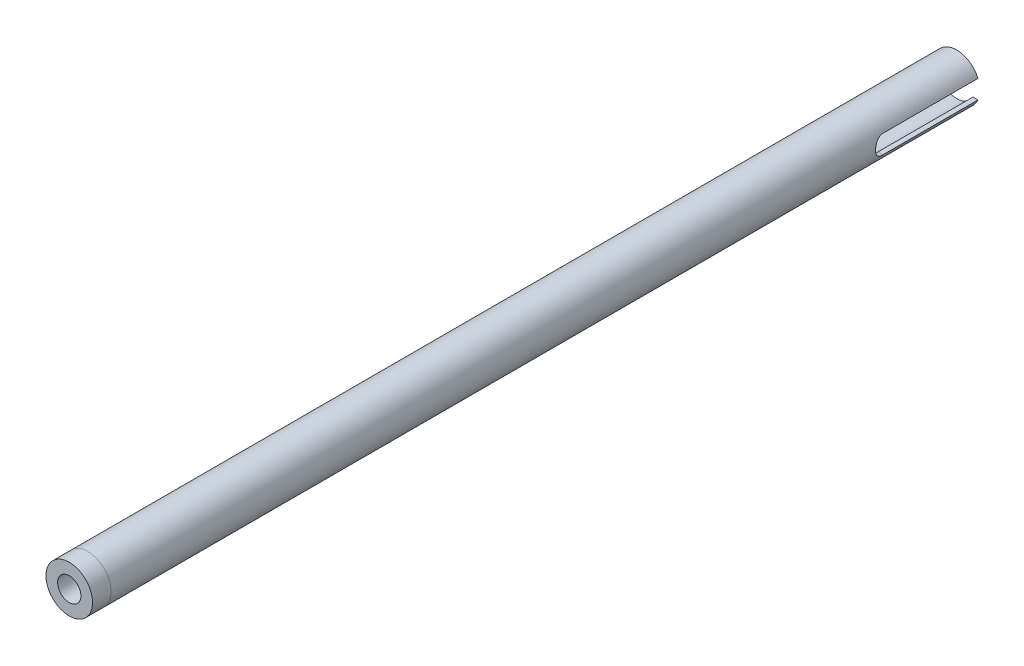
ISO-10303-21;
HEADER;
FILE_DESCRIPTION(('STEP AP214'),'2;1');
FILE_NAME('part.step','',(''),(''),'','','');
FILE_SCHEMA(('AUTOMOTIVE_DESIGN { 1 0 10303 214 1 1 1 1 }'));
ENDSEC;
DATA;
#1=APPLICATION_CONTEXT('core data for automotive mechanical design processes');
#2=APPLICATION_PROTOCOL_DEFINITION('international standard','automotive_design',2000,#1);
#3=PRODUCT_CONTEXT('',#1,'mechanical');
#4=PRODUCT('Part','Part','',(#3));
#5=PRODUCT_RELATED_PRODUCT_CATEGORY('part','',(#4));
#6=PRODUCT_DEFINITION_FORMATION('','',#4);
#7=PRODUCT_DEFINITION_CONTEXT('part definition',#1,'design');
#8=PRODUCT_DEFINITION('design','',#6,#7);
#9=PRODUCT_DEFINITION_SHAPE('','',#8);
#10=(LENGTH_UNIT() NAMED_UNIT(*) SI_UNIT(.MILLI.,.METRE.));
#11=(NAMED_UNIT(*) PLANE_ANGLE_UNIT() SI_UNIT($,.RADIAN.));
#12=(NAMED_UNIT(*) SI_UNIT($,.STERADIAN.) SOLID_ANGLE_UNIT());
#13=UNCERTAINTY_MEASURE_WITH_UNIT(LENGTH_MEASURE(1.E-05),#10,'distance_accuracy_value','');
#14=(GEOMETRIC_REPRESENTATION_CONTEXT(3) GLOBAL_UNCERTAINTY_ASSIGNED_CONTEXT((#13)) GLOBAL_UNIT_ASSIGNED_CONTEXT((#10,
#11,#12)) REPRESENTATION_CONTEXT('',''));
#15=CARTESIAN_POINT('',(0.,0.,0.));
#16=DIRECTION('',(0.,0.,1.));
#17=DIRECTION('',(1.,0.,0.));
#18=AXIS2_PLACEMENT_3D('',#15,#16,#17);
#19=CARTESIAN_POINT('',(0.,0.,-302.369232505342));
#20=DIRECTION('',(0.,0.,1.));
#21=DIRECTION('',(1.,0.,0.));
#22=AXIS2_PLACEMENT_3D('',#19,#20,#21);
#23=CYLINDRICAL_SURFACE('',#22,7.9375);
#24=CARTESIAN_POINT('',(0.,0.,-6.35));
#25=DIRECTION('',(0.,0.,1.));
#26=DIRECTION('',(1.,0.,0.));
#27=AXIS2_PLACEMENT_3D('',#24,#25,#26);
#28=CIRCLE('',#27,7.9375);
#29=CARTESIAN_POINT('',(7.9375,0.,-6.35));
#30=VERTEX_POINT('',#29);
#31=EDGE_CURVE('E167',#30,#30,#28,.T.);
#32=ORIENTED_EDGE('',*,*,#31,.F.);
#33=EDGE_LOOP('',(#32));
#34=FACE_BOUND('',#33,.T.);
#35=CARTESIAN_POINT('',(-7.2748389157424,3.175,-269.984232505342));
#36=CARTESIAN_POINT('',(-7.27482137043434,3.17501267173453,-269.89881238986));
#37=CARTESIAN_POINT('',(-7.27634297592672,3.17155313247793,-269.813401860297));
#38=CARTESIAN_POINT('',(-7.28233338484875,3.15778866907725,-269.643269855969));
#39=CARTESIAN_POINT('',(-7.28680106535325,3.14748635311323,-269.55854813111));
#40=CARTESIAN_POINT('',(-7.2985291631267,3.12019002880163,-269.390734431301));
#41=CARTESIAN_POINT('',(-7.30577831906487,3.10322299732752,-269.307637286542));
#42=CARTESIAN_POINT('',(-7.32282161153744,3.06278779397035,-269.143326184517));
#43=CARTESIAN_POINT('',(-7.33261590324725,3.03931922568674,-269.062112342403));
#44=CARTESIAN_POINT('',(-7.36535331460444,2.95952924342962,-268.822287519821));
#45=CARTESIAN_POINT('',(-7.39167595677839,2.89376893609239,-268.667162591017));
#46=CARTESIAN_POINT('',(-7.45033259991547,2.73920602658923,-268.370075164306));
#47=CARTESIAN_POINT('',(-7.48267254395243,2.65038060922872,-268.228125889088));
#48=CARTESIAN_POINT('',(-7.55175295441387,2.44684429809694,-267.953405119568));
#49=CARTESIAN_POINT('',(-7.58863404630155,2.33103943595687,-267.821477735056));
#50=CARTESIAN_POINT('',(-7.66147718953598,2.07914562663533,-267.578314851424));
#51=CARTESIAN_POINT('',(-7.69743902899202,1.94305205135846,-267.467084086497));
#52=CARTESIAN_POINT('',(-7.76611692840651,1.64778282664419,-267.264162887001));
#53=CARTESIAN_POINT('',(-7.79864638434712,1.48790317306356,-267.173428475597));
#54=CARTESIAN_POINT('',(-7.85502980346525,1.15369615984563,-267.02057092218));
#55=CARTESIAN_POINT('',(-7.87889360585224,0.979385463602722,-266.958415309562));
#56=CARTESIAN_POINT('',(-7.91022225039827,0.670405323433354,-266.877903665907));
#57=CARTESIAN_POINT('',(-7.92038443902171,0.537888188660439,-266.852225742497));
#58=CARTESIAN_POINT('',(-7.93061686811603,0.337231082382107,-266.826470659416));
#59=CARTESIAN_POINT('',(-7.93319257341971,0.269991647180298,-266.820012562135));
#60=CARTESIAN_POINT('',(-7.93663621925193,0.135173873369596,-266.811391544383));
#61=CARTESIAN_POINT('',(-7.93750363389236,0.0675954368175869,-266.809229946565));
#62=CARTESIAN_POINT('',(-7.9375,0.,-266.809232505342));
#63=B_SPLINE_CURVE_WITH_KNOTS('',3,(#35,#36,#37,#38,#39,#40,#41,#42,#43,#44,#45,#46,#47,#48,#49,
#50,#51,#52,#53,#54,#55,#56,#57,#58,#59,#60,#61,#62),.UNSPECIFIED.,.F.,.F.,(4,2,2,2,2,2,2,2,2,2,
2,2,2,4),(0.,0.256160797396612,0.512224013007058,0.767261264672238,1.02231406945471,
1.53142416248594,2.04103978047897,2.57679273649405,3.11266809162683,3.66991136029742,
4.22651992730645,4.63134321412666,4.8339937586662,5.03670667834028),.UNSPECIFIED.);
#64=CARTESIAN_POINT('',(-7.2748389157424,3.175,-269.984232505342));
#65=VERTEX_POINT('',#64);
#66=CARTESIAN_POINT('',(-7.9375,0.,-266.809232505342));
#67=VERTEX_POINT('',#66);
#68=EDGE_CURVE('E194',#65,#67,#63,.T.);
#69=ORIENTED_EDGE('',*,*,#68,.T.);
#70=CARTESIAN_POINT('',(-7.9375,0.,-266.809232505342));
#71=CARTESIAN_POINT('',(-7.93751279435796,-0.0856973243893185,-266.809220475173));
#72=CARTESIAN_POINT('',(-7.93611246860092,-0.171386675169291,-266.812701842645));
#73=CARTESIAN_POINT('',(-7.93058107051394,-0.342092796869088,-266.82655793798));
#74=CARTESIAN_POINT('',(-7.92645080745519,-0.427109759557717,-266.836930622963));
#75=CARTESIAN_POINT('',(-7.91557399086504,-0.595570690948319,-266.86442781703));
#76=CARTESIAN_POINT('',(-7.90883664469869,-0.67901912358001,-266.881528568303));
#77=CARTESIAN_POINT('',(-7.89293284658536,-0.844038966454646,-266.922295815777));
#78=CARTESIAN_POINT('',(-7.88376629739099,-0.925610301410303,-266.945962574834));
#79=CARTESIAN_POINT('',(-7.85297007832481,-1.16656173687588,-267.026470230532));
#80=CARTESIAN_POINT('',(-7.82802544143958,-1.32244720282989,-267.092862863409));
#81=CARTESIAN_POINT('',(-7.77174407779742,-1.62081902572888,-267.248908267402));
#82=CARTESIAN_POINT('',(-7.74040257287306,-1.7632952496653,-267.338578439465));
#83=CARTESIAN_POINT('',(-7.67287736621953,-2.03755465224644,-267.543032046981));
#84=CARTESIAN_POINT('',(-7.63654472176442,-2.16862853615059,-267.658718903712));
#85=CARTESIAN_POINT('',(-7.56380976030912,-2.41011022612819,-267.910013005421));
#86=CARTESIAN_POINT('',(-7.52740741976911,-2.52050895891189,-268.045628949903));
#87=CARTESIAN_POINT('',(-7.45683282624284,-2.72240939900242,-268.34032744477));
#88=CARTESIAN_POINT('',(-7.4228346735038,-2.81283701743189,-268.500191434685));
#89=CARTESIAN_POINT('',(-7.3633362219632,-2.96511894168388,-268.834317399482));
#90=CARTESIAN_POINT('',(-7.33782422493328,-3.02701262758154,-269.008559137241));
#91=CARTESIAN_POINT('',(-7.30424985403508,-3.10695047193342,-269.316862861892));
#92=CARTESIAN_POINT('',(-7.29331360019113,-3.13238569878909,-269.448721622778));
#93=CARTESIAN_POINT('',(-7.28227977674291,-3.15790858319001,-269.648438504472));
#94=CARTESIAN_POINT('',(-7.27949685702346,-3.16431127275807,-269.715386795232));
#95=CARTESIAN_POINT('',(-7.27577355567174,-3.17285909036155,-269.849628353098));
#96=CARTESIAN_POINT('',(-7.27483380475762,-3.1750027609968,-269.916921730396));
#97=CARTESIAN_POINT('',(-7.2748389157424,-3.175,-269.984232505342));
#98=B_SPLINE_CURVE_WITH_KNOTS('',3,(#70,#71,#72,#73,#74,#75,#76,#77,#78,#79,#80,#81,#82,#83,#84,
#85,#86,#87,#88,#89,#90,#91,#92,#93,#94,#95,#96,#97),.UNSPECIFIED.,.F.,.F.,(4,2,2,2,2,2,2,2,2,2,
2,2,2,4),(0.,0.256996432008007,0.513916713336978,0.769937797705386,1.02596913282157,
1.53722547809954,2.04886511530059,2.58219314099272,3.11575467201799,3.67332953074261,
4.2301325519037,4.63306130520181,4.83485003827446,5.03670780985612),.UNSPECIFIED.);
#99=CARTESIAN_POINT('',(-7.2748389157424,-3.175,-269.984232505342));
#100=VERTEX_POINT('',#99);
#101=EDGE_CURVE('E146',#67,#100,#98,.T.);
#102=ORIENTED_EDGE('',*,*,#101,.T.);
#103=DIRECTION('',(0.,0.,-1.));
#104=VECTOR('',#103,1.);
#105=CARTESIAN_POINT('',(-7.2748389157424,-3.175,-266.809232505342));
#106=LINE('',#105,#104);
#107=CARTESIAN_POINT('',(-7.2748389157424,-3.175,-302.369232505342));
#108=VERTEX_POINT('',#107);
#109=EDGE_CURVE('E141',#100,#108,#106,.T.);
#110=ORIENTED_EDGE('',*,*,#109,.T.);
#111=CARTESIAN_POINT('',(0.,0.,-302.369232505342));
#112=DIRECTION('',(0.,0.,1.));
#113=DIRECTION('',(1.,0.,0.));
#114=AXIS2_PLACEMENT_3D('',#111,#112,#113);
#115=CIRCLE('',#114,7.9375);
#116=CARTESIAN_POINT('',(7.2748389157424,-3.175,-302.369232505342));
#117=VERTEX_POINT('',#116);
#118=EDGE_CURVE('E144',#108,#117,#115,.T.);
#119=ORIENTED_EDGE('',*,*,#118,.T.);
#120=DIRECTION('',(0.,0.,-1.));
#121=VECTOR('',#120,1.);
#122=CARTESIAN_POINT('',(7.2748389157424,-3.175,-266.809232505342));
#123=LINE('',#122,#121);
#124=CARTESIAN_POINT('',(7.2748389157424,-3.175,-269.984232505342));
#125=VERTEX_POINT('',#124);
#126=EDGE_CURVE('E427',#125,#117,#123,.T.);
#127=ORIENTED_EDGE('',*,*,#126,.F.);
#128=CARTESIAN_POINT('',(7.2748389157424,-3.175,-269.984232505342));
#129=CARTESIAN_POINT('',(7.27482137043434,-3.17501267173453,-269.89881238986));
#130=CARTESIAN_POINT('',(7.27634297592672,-3.17155313247793,-269.813401860297));
#131=CARTESIAN_POINT('',(7.28233338484875,-3.15778866907725,-269.643269855969));
#132=CARTESIAN_POINT('',(7.28680106535325,-3.14748635311323,-269.55854813111));
#133=CARTESIAN_POINT('',(7.2985291631267,-3.12019002880163,-269.390734431301));
#134=CARTESIAN_POINT('',(7.30577831906487,-3.10322299732752,-269.307637286542));
#135=CARTESIAN_POINT('',(7.32282161153744,-3.06278779397035,-269.143326184517));
#136=CARTESIAN_POINT('',(7.33261590324725,-3.03931922568674,-269.062112342403));
#137=CARTESIAN_POINT('',(7.36535331460444,-2.95952924342962,-268.822287519821));
#138=CARTESIAN_POINT('',(7.39167595677839,-2.89376893609239,-268.667162591017));
#139=CARTESIAN_POINT('',(7.45033259991547,-2.73920602658923,-268.370075164306));
#140=CARTESIAN_POINT('',(7.48267254395243,-2.65038060922872,-268.228125889088));
#141=CARTESIAN_POINT('',(7.55175295441387,-2.44684429809694,-267.953405119568));
#142=CARTESIAN_POINT('',(7.58863404630155,-2.33103943595687,-267.821477735056));
#143=CARTESIAN_POINT('',(7.66147718953598,-2.07914562663533,-267.578314851424));
#144=CARTESIAN_POINT('',(7.69743902899202,-1.94305205135846,-267.467084086497));
#145=CARTESIAN_POINT('',(7.76611692840651,-1.64778282664419,-267.264162887001));
#146=CARTESIAN_POINT('',(7.79864638434712,-1.48790317306356,-267.173428475597));
#147=CARTESIAN_POINT('',(7.85502980346525,-1.15369615984563,-267.02057092218));
#148=CARTESIAN_POINT('',(7.87889360585224,-0.979385463602722,-266.958415309562));
#149=CARTESIAN_POINT('',(7.91022225039827,-0.670405323433354,-266.877903665907));
#150=CARTESIAN_POINT('',(7.92038443902171,-0.537888188660439,-266.852225742497));
#151=CARTESIAN_POINT('',(7.93061686811603,-0.337231082382107,-266.826470659416));
#152=CARTESIAN_POINT('',(7.93319257341971,-0.269991647180298,-266.820012562135));
#153=CARTESIAN_POINT('',(7.93663621925193,-0.135173873369596,-266.811391544383));
#154=CARTESIAN_POINT('',(7.93750363389236,-0.0675954368175869,-266.809229946565));
#155=CARTESIAN_POINT('',(7.9375,0.,-266.809232505342));
#156=B_SPLINE_CURVE_WITH_KNOTS('',3,(#128,#129,#130,#131,#132,#133,#134,#135,#136,#137,#138,
#139,#140,#141,#142,#143,#144,#145,#146,#147,#148,#149,#150,#151,#152,#153,#154,#155),
.UNSPECIFIED.,.F.,.F.,(4,2,2,2,2,2,2,2,2,2,2,2,2,4),(0.,0.256160797396612,0.512224013007058,
0.767261264672238,1.02231406945471,1.53142416248594,2.04103978047897,2.57679273649405,
3.11266809162683,3.66991136029742,4.22651992730645,4.63134321412666,4.8339937586662,
5.03670667834028),.UNSPECIFIED.);
#157=CARTESIAN_POINT('',(7.9375,0.,-266.809232505342));
#158=VERTEX_POINT('',#157);
#159=EDGE_CURVE('E87',#125,#158,#156,.T.);
#160=ORIENTED_EDGE('',*,*,#159,.T.);
#161=CARTESIAN_POINT('',(7.9375,0.,-266.809232505342));
#162=CARTESIAN_POINT('',(7.93751279435796,0.0856973243893185,-266.809220475173));
#163=CARTESIAN_POINT('',(7.93611246860092,0.171386675169291,-266.812701842645));
#164=CARTESIAN_POINT('',(7.93058107051394,0.342092796869088,-266.82655793798));
#165=CARTESIAN_POINT('',(7.92645080745519,0.427109759557717,-266.836930622963));
#166=CARTESIAN_POINT('',(7.91557399086504,0.595570690948319,-266.86442781703));
#167=CARTESIAN_POINT('',(7.90883664469869,0.67901912358001,-266.881528568303));
#168=CARTESIAN_POINT('',(7.89293284658536,0.844038966454646,-266.922295815777));
#169=CARTESIAN_POINT('',(7.88376629739099,0.925610301410303,-266.945962574834));
#170=CARTESIAN_POINT('',(7.85297007832481,1.16656173687588,-267.026470230532));
#171=CARTESIAN_POINT('',(7.82802544143958,1.32244720282989,-267.092862863409));
#172=CARTESIAN_POINT('',(7.77174407779742,1.62081902572888,-267.248908267402));
#173=CARTESIAN_POINT('',(7.74040257287306,1.7632952496653,-267.338578439465));
#174=CARTESIAN_POINT('',(7.67287736621953,2.03755465224644,-267.543032046981));
#175=CARTESIAN_POINT('',(7.63654472176442,2.16862853615059,-267.658718903712));
#176=CARTESIAN_POINT('',(7.56380976030912,2.41011022612819,-267.910013005421));
#177=CARTESIAN_POINT('',(7.52740741976911,2.52050895891189,-268.045628949903));
#178=CARTESIAN_POINT('',(7.45683282624284,2.72240939900242,-268.34032744477));
#179=CARTESIAN_POINT('',(7.4228346735038,2.81283701743189,-268.500191434685));
#180=CARTESIAN_POINT('',(7.3633362219632,2.96511894168388,-268.834317399482));
#181=CARTESIAN_POINT('',(7.33782422493328,3.02701262758154,-269.008559137241));
#182=CARTESIAN_POINT('',(7.30424985403508,3.10695047193342,-269.316862861892));
#183=CARTESIAN_POINT('',(7.29331360019113,3.13238569878909,-269.448721622778));
#184=CARTESIAN_POINT('',(7.28227977674291,3.15790858319001,-269.648438504472));
#185=CARTESIAN_POINT('',(7.27949685702346,3.16431127275807,-269.715386795232));
#186=CARTESIAN_POINT('',(7.27577355567174,3.17285909036155,-269.849628353098));
#187=CARTESIAN_POINT('',(7.27483380475762,3.1750027609968,-269.916921730396));
#188=CARTESIAN_POINT('',(7.2748389157424,3.175,-269.984232505342));
#189=B_SPLINE_CURVE_WITH_KNOTS('',3,(#161,#162,#163,#164,#165,#166,#167,#168,#169,#170,#171,
#172,#173,#174,#175,#176,#177,#178,#179,#180,#181,#182,#183,#184,#185,#186,#187,#188),
.UNSPECIFIED.,.F.,.F.,(4,2,2,2,2,2,2,2,2,2,2,2,2,4),(0.,0.256996432008007,0.513916713336978,
0.769937797705386,1.02596913282157,1.53722547809954,2.04886511530059,2.58219314099272,
3.11575467201799,3.67332953074261,4.2301325519037,4.63306130520181,4.83485003827446,
5.03670780985612),.UNSPECIFIED.);
#190=CARTESIAN_POINT('',(7.2748389157424,3.175,-269.984232505342));
#191=VERTEX_POINT('',#190);
#192=EDGE_CURVE('E73',#158,#191,#189,.T.);
#193=ORIENTED_EDGE('',*,*,#192,.T.);
#194=DIRECTION('',(0.,0.,-1.));
#195=VECTOR('',#194,1.);
#196=CARTESIAN_POINT('',(7.2748389157424,3.175,-266.809232505342));
#197=LINE('',#196,#195);
#198=CARTESIAN_POINT('',(7.2748389157424,3.175,-302.369232505342));
#199=VERTEX_POINT('',#198);
#200=EDGE_CURVE('E160',#191,#199,#197,.T.);
#201=ORIENTED_EDGE('',*,*,#200,.T.);
#202=CARTESIAN_POINT('',(-7.2748389157424,3.175,-302.369232505342));
#203=VERTEX_POINT('',#202);
#204=EDGE_CURVE('E166',#199,#203,#115,.T.);
#205=ORIENTED_EDGE('',*,*,#204,.T.);
#206=DIRECTION('',(0.,0.,-1.));
#207=VECTOR('',#206,1.);
#208=CARTESIAN_POINT('',(-7.2748389157424,3.175,-266.809232505342));
#209=LINE('',#208,#207);
#210=EDGE_CURVE('E420',#65,#203,#209,.T.);
#211=ORIENTED_EDGE('',*,*,#210,.F.);
#212=EDGE_LOOP('',(#69,#102,#110,#119,#127,#160,#193,#201,#205,#211));
#213=FACE_BOUND('',#212,.T.);
#214=ADVANCED_FACE('F63',(#34,#213),#23,.T.);
#215=CARTESIAN_POINT('',(0.,0.,-302.369232505342));
#216=DIRECTION('',(0.,0.,1.));
#217=DIRECTION('',(1.,0.,0.));
#218=AXIS2_PLACEMENT_3D('',#215,#216,#217);
#219=PLANE('',#218);
#220=DIRECTION('',(1.,0.,0.));
#221=VECTOR('',#220,1.);
#222=CARTESIAN_POINT('',(0.,-3.175,-302.369232505342));
#223=LINE('',#222,#221);
#224=CARTESIAN_POINT('',(-5.57246419907746,-3.175,-302.369232505342));
#225=VERTEX_POINT('',#224);
#226=EDGE_CURVE('E153',#108,#225,#223,.T.);
#227=ORIENTED_EDGE('',*,*,#226,.T.);
#228=CARTESIAN_POINT('',(0.,0.,-302.369232505342));
#229=DIRECTION('',(0.,0.,1.));
#230=DIRECTION('',(1.,0.,0.));
#231=AXIS2_PLACEMENT_3D('',#228,#229,#230);
#232=CIRCLE('',#231,6.4135);
#233=CARTESIAN_POINT('',(5.57246419907746,-3.175,-302.369232505342));
#234=VERTEX_POINT('',#233);
#235=EDGE_CURVE('E275',#225,#234,#232,.T.);
#236=ORIENTED_EDGE('',*,*,#235,.T.);
#237=DIRECTION('',(1.,0.,0.));
#238=VECTOR('',#237,1.);
#239=CARTESIAN_POINT('',(0.,-3.175,-302.369232505342));
#240=LINE('',#239,#238);
#241=EDGE_CURVE('E165',#234,#117,#240,.T.);
#242=ORIENTED_EDGE('',*,*,#241,.T.);
#243=ORIENTED_EDGE('',*,*,#118,.F.);
#244=EDGE_LOOP('',(#227,#236,#242,#243));
#245=FACE_BOUND('',#244,.T.);
#246=ADVANCED_FACE('F163',(#245),#219,.F.);
#247=CARTESIAN_POINT('',(0.,0.,-302.369232505342));
#248=DIRECTION('',(0.,0.,1.));
#249=DIRECTION('',(1.,0.,0.));
#250=AXIS2_PLACEMENT_3D('',#247,#248,#249);
#251=CYLINDRICAL_SURFACE('',#250,6.4135);
#252=CARTESIAN_POINT('',(0.,0.,-6.35));
#253=DIRECTION('',(0.,0.,1.));
#254=DIRECTION('',(1.,0.,0.));
#255=AXIS2_PLACEMENT_3D('',#252,#253,#254);
#256=CIRCLE('',#255,6.4135);
#257=CARTESIAN_POINT('',(6.4135,0.,-6.35));
#258=VERTEX_POINT('',#257);
#259=EDGE_CURVE('E149',#258,#258,#256,.T.);
#260=ORIENTED_EDGE('',*,*,#259,.T.);
#261=EDGE_LOOP('',(#260));
#262=FACE_BOUND('',#261,.T.);
#263=DIRECTION('',(0.,0.,-1.));
#264=VECTOR('',#263,1.);
#265=CARTESIAN_POINT('',(-5.57246419907746,-3.175,-266.809232505342));
#266=LINE('',#265,#264);
#267=CARTESIAN_POINT('',(-5.57246419907746,-3.175,-269.984232505342));
#268=VERTEX_POINT('',#267);
#269=EDGE_CURVE('E150',#268,#225,#266,.T.);
#270=ORIENTED_EDGE('',*,*,#269,.F.);
#271=CARTESIAN_POINT('',(-5.57246419907746,-3.175,-269.984232505342));
#272=CARTESIAN_POINT('',(-5.57244013006406,-3.17501485930532,-269.900953392304));
#273=CARTESIAN_POINT('',(-5.57433046393327,-3.17172393593588,-269.817687625433));
#274=CARTESIAN_POINT('',(-5.58175879139227,-3.15864741746939,-269.651880040621));
#275=CARTESIAN_POINT('',(-5.58729459414879,-3.14886572313217,-269.56933781802));
#276=CARTESIAN_POINT('',(-5.60179156831922,-3.12299843383605,-269.406041011291));
#277=CARTESIAN_POINT('',(-5.61073298145,-3.10694918790095,-269.325278906377));
#278=CARTESIAN_POINT('',(-5.63171276239417,-3.06875665913499,-269.165634990876));
#279=CARTESIAN_POINT('',(-5.64375147558632,-3.04661269666535,-269.086753391056));
#280=CARTESIAN_POINT('',(-5.6838799338154,-2.97148657354666,-268.854020216058));
#281=CARTESIAN_POINT('',(-5.71602843451584,-2.90973243042152,-268.703599718819));
#282=CARTESIAN_POINT('',(-5.78746445334561,-2.76491119647661,-268.415142501991));
#283=CARTESIAN_POINT('',(-5.8267630725243,-2.68181088046089,-268.277125544625));
#284=CARTESIAN_POINT('',(-5.91189137020974,-2.48887418737119,-268.005328460597));
#285=CARTESIAN_POINT('',(-5.95799203211627,-2.37743022169016,-267.872771658145));
#286=CARTESIAN_POINT('',(-6.04933625068999,-2.13433179626949,-267.627303989073));
#287=CARTESIAN_POINT('',(-6.09457954365871,-2.00267122837297,-267.51439908206));
#288=CARTESIAN_POINT('',(-6.18270630442022,-1.71220053093684,-267.304079789607));
#289=CARTESIAN_POINT('',(-6.22523407848511,-1.55216870534977,-267.208190039176));
#290=CARTESIAN_POINT('',(-6.29953728626817,-1.21586879246633,-267.045341142859));
#291=CARTESIAN_POINT('',(-6.33132906884324,-1.03962591706377,-266.978337964816));
#292=CARTESIAN_POINT('',(-6.37455801221378,-0.719418942476251,-266.888466132486));
#293=CARTESIAN_POINT('',(-6.38903678436651,-0.577736145507957,-266.858893418121));
#294=CARTESIAN_POINT('',(-6.40364692368403,-0.362616983152034,-266.829172343807));
#295=CARTESIAN_POINT('',(-6.40733246196224,-0.290370591494075,-266.821704831169));
#296=CARTESIAN_POINT('',(-6.41226237468065,-0.145424356491903,-266.811731942231));
#297=CARTESIAN_POINT('',(-6.41350576158006,-0.0727243416303698,-266.809228573294));
#298=CARTESIAN_POINT('',(-6.4135,0.,-266.809232505342));
#299=B_SPLINE_CURVE_WITH_KNOTS('',3,(#271,#272,#273,#274,#275,#276,#277,#278,#279,#280,#281,
#282,#283,#284,#285,#286,#287,#288,#289,#290,#291,#292,#293,#294,#295,#296,#297,#298),
.UNSPECIFIED.,.F.,.F.,(4,2,2,2,2,2,2,2,2,2,2,2,2,4),(0.,0.249729002226608,0.499308060527582,
0.747460667546715,0.995640957972498,1.49055300136654,1.98624009021394,2.52160227908797,
3.05712653941521,3.62817923327589,4.19835836008502,4.63305000595099,4.85103401853339,
5.06910615989469),.UNSPECIFIED.);
#300=CARTESIAN_POINT('',(-6.4135,0.,-266.809232505342));
#301=VERTEX_POINT('',#300);
#302=EDGE_CURVE('E221',#268,#301,#299,.T.);
#303=ORIENTED_EDGE('',*,*,#302,.T.);
#304=CARTESIAN_POINT('',(-6.4135,0.,-266.809232505342));
#305=CARTESIAN_POINT('',(-6.41351478956105,0.0839162873638195,-266.809219105446));
#306=CARTESIAN_POINT('',(-6.41185341043851,0.167823114288182,-266.812559031493));
#307=CARTESIAN_POINT('',(-6.40528923860734,0.33495253632637,-266.825841472098));
#308=CARTESIAN_POINT('',(-6.40038773102953,0.418175389480093,-266.835781368919));
#309=CARTESIAN_POINT('',(-6.38748331817869,0.58296549878522,-266.862100173437));
#310=CARTESIAN_POINT('',(-6.37949454331383,0.664538541389253,-266.878449748925));
#311=CARTESIAN_POINT('',(-6.36062930478242,0.825821595252368,-266.917388052518));
#312=CARTESIAN_POINT('',(-6.34975266552956,0.905531492908811,-266.939977159999));
#313=CARTESIAN_POINT('',(-6.31319792977548,1.14087800407252,-267.016713722759));
#314=CARTESIAN_POINT('',(-6.28356695572383,1.29306927815055,-267.079885370947));
#315=CARTESIAN_POINT('',(-6.21648032622801,1.58455945770353,-267.228036112927));
#316=CARTESIAN_POINT('',(-6.17901685649499,1.72384528592309,-267.313037004707));
#317=CARTESIAN_POINT('',(-6.09713913910647,1.99475482128856,-267.508137142958));
#318=CARTESIAN_POINT('',(-6.05244508581476,2.12544046453043,-267.619422019696));
#319=CARTESIAN_POINT('',(-5.96206469267669,2.36716277188881,-267.861391465861));
#320=CARTESIAN_POINT('',(-5.9163776032387,2.47818397002904,-267.992091157701));
#321=CARTESIAN_POINT('',(-5.82517699615972,2.68591268931947,-268.281136986653));
#322=CARTESIAN_POINT('',(-5.77994318763785,2.78087960507694,-268.440832181233));
#323=CARTESIAN_POINT('',(-5.69959190124919,2.9420744279085,-268.776215458415));
#324=CARTESIAN_POINT('',(-5.66445328320705,3.00836254036259,-268.951869091587));
#325=CARTESIAN_POINT('',(-5.61637168534323,3.09697219420915,-269.27032046598));
#326=CARTESIAN_POINT('',(-5.60011055849822,3.1260622343607,-269.41073506864));
#327=CARTESIAN_POINT('',(-5.58363385282995,3.15533369889112,-269.624111946883));
#328=CARTESIAN_POINT('',(-5.57946041232981,3.16269716900745,-269.695843671764));
#329=CARTESIAN_POINT('',(-5.57386984218861,3.17253394278506,-269.839785611807));
#330=CARTESIAN_POINT('',(-5.57245416126573,3.17500467618403,-269.911996058478));
#331=CARTESIAN_POINT('',(-5.57246419907746,3.175,-269.984232505342));
#332=B_SPLINE_CURVE_WITH_KNOTS('',3,(#304,#305,#306,#307,#308,#309,#310,#311,#312,#313,#314,
#315,#316,#317,#318,#319,#320,#321,#322,#323,#324,#325,#326,#327,#328,#329,#330,#331),
.UNSPECIFIED.,.F.,.F.,(4,2,2,2,2,2,2,2,2,2,2,2,2,4),(0.,0.251650249697328,0.503200747298848,
0.75361328099314,1.00404104361821,1.50387930503274,2.00421864304453,2.53410176460237,
3.06439980342596,3.63519589642624,4.20478783377489,4.63602373673194,4.85251353275904,
5.06911702550462),.UNSPECIFIED.);
#333=CARTESIAN_POINT('',(-5.57246419907746,3.175,-269.984232505342));
#334=VERTEX_POINT('',#333);
#335=EDGE_CURVE('E186',#301,#334,#332,.T.);
#336=ORIENTED_EDGE('',*,*,#335,.T.);
#337=DIRECTION('',(0.,0.,-1.));
#338=VECTOR('',#337,1.);
#339=CARTESIAN_POINT('',(-5.57246419907746,3.175,-266.809232505342));
#340=LINE('',#339,#338);
#341=CARTESIAN_POINT('',(-5.57246419907746,3.175,-302.369232505342));
#342=VERTEX_POINT('',#341);
#343=EDGE_CURVE('E417',#334,#342,#340,.T.);
#344=ORIENTED_EDGE('',*,*,#343,.T.);
#345=CARTESIAN_POINT('',(5.57246419907746,3.175,-302.369232505342));
#346=VERTEX_POINT('',#345);
#347=EDGE_CURVE('E172',#346,#342,#232,.T.);
#348=ORIENTED_EDGE('',*,*,#347,.F.);
#349=DIRECTION('',(0.,0.,-1.));
#350=VECTOR('',#349,1.);
#351=CARTESIAN_POINT('',(5.57246419907746,3.175,-266.809232505342));
#352=LINE('',#351,#350);
#353=CARTESIAN_POINT('',(5.57246419907746,3.175,-269.984232505342));
#354=VERTEX_POINT('',#353);
#355=EDGE_CURVE('E269',#354,#346,#352,.T.);
#356=ORIENTED_EDGE('',*,*,#355,.F.);
#357=CARTESIAN_POINT('',(5.57246419907746,3.175,-269.984232505342));
#358=CARTESIAN_POINT('',(5.57244013006406,3.17501485930532,-269.900953392304));
#359=CARTESIAN_POINT('',(5.57433046393327,3.17172393593588,-269.817687625433));
#360=CARTESIAN_POINT('',(5.58175879139227,3.15864741746939,-269.651880040621));
#361=CARTESIAN_POINT('',(5.58729459414879,3.14886572313217,-269.56933781802));
#362=CARTESIAN_POINT('',(5.60179156831922,3.12299843383605,-269.406041011291));
#363=CARTESIAN_POINT('',(5.61073298145,3.10694918790095,-269.325278906377));
#364=CARTESIAN_POINT('',(5.63171276239417,3.06875665913499,-269.165634990876));
#365=CARTESIAN_POINT('',(5.64375147558632,3.04661269666535,-269.086753391056));
#366=CARTESIAN_POINT('',(5.6838799338154,2.97148657354666,-268.854020216058));
#367=CARTESIAN_POINT('',(5.71602843451584,2.90973243042152,-268.703599718819));
#368=CARTESIAN_POINT('',(5.78746445334561,2.76491119647661,-268.415142501991));
#369=CARTESIAN_POINT('',(5.8267630725243,2.68181088046089,-268.277125544625));
#370=CARTESIAN_POINT('',(5.91189137020974,2.48887418737119,-268.005328460597));
#371=CARTESIAN_POINT('',(5.95799203211627,2.37743022169016,-267.872771658145));
#372=CARTESIAN_POINT('',(6.04933625068999,2.13433179626949,-267.627303989073));
#373=CARTESIAN_POINT('',(6.09457954365871,2.00267122837297,-267.51439908206));
#374=CARTESIAN_POINT('',(6.18270630442022,1.71220053093684,-267.304079789607));
#375=CARTESIAN_POINT('',(6.22523407848511,1.55216870534977,-267.208190039176));
#376=CARTESIAN_POINT('',(6.29953728626817,1.21586879246633,-267.045341142859));
#377=CARTESIAN_POINT('',(6.33132906884324,1.03962591706377,-266.978337964816));
#378=CARTESIAN_POINT('',(6.37455801221378,0.719418942476251,-266.888466132486));
#379=CARTESIAN_POINT('',(6.38903678436651,0.577736145507957,-266.858893418121));
#380=CARTESIAN_POINT('',(6.40364692368403,0.362616983152034,-266.829172343807));
#381=CARTESIAN_POINT('',(6.40733246196224,0.290370591494075,-266.821704831169));
#382=CARTESIAN_POINT('',(6.41226237468065,0.145424356491903,-266.811731942231));
#383=CARTESIAN_POINT('',(6.41350576158006,0.0727243416303698,-266.809228573294));
#384=CARTESIAN_POINT('',(6.4135,0.,-266.809232505342));
#385=B_SPLINE_CURVE_WITH_KNOTS('',3,(#357,#358,#359,#360,#361,#362,#363,#364,#365,#366,#367,
#368,#369,#370,#371,#372,#373,#374,#375,#376,#377,#378,#379,#380,#381,#382,#383,#384),
.UNSPECIFIED.,.F.,.F.,(4,2,2,2,2,2,2,2,2,2,2,2,2,4),(0.,0.249729002226608,0.499308060527582,
0.747460667546715,0.995640957972498,1.49055300136654,1.98624009021394,2.52160227908797,
3.05712653941521,3.62817923327589,4.19835836008502,4.63305000595099,4.85103401853339,
5.06910615989469),.UNSPECIFIED.);
#386=CARTESIAN_POINT('',(6.4135,0.,-266.809232505342));
#387=VERTEX_POINT('',#386);
#388=EDGE_CURVE('E13',#354,#387,#385,.T.);
#389=ORIENTED_EDGE('',*,*,#388,.T.);
#390=CARTESIAN_POINT('',(6.4135,0.,-266.809232505342));
#391=CARTESIAN_POINT('',(6.41351478956105,-0.0839162873638195,-266.809219105446));
#392=CARTESIAN_POINT('',(6.41185341043851,-0.167823114288182,-266.812559031493));
#393=CARTESIAN_POINT('',(6.40528923860734,-0.33495253632637,-266.825841472098));
#394=CARTESIAN_POINT('',(6.40038773102953,-0.418175389480093,-266.835781368919));
#395=CARTESIAN_POINT('',(6.38748331817869,-0.58296549878522,-266.862100173437));
#396=CARTESIAN_POINT('',(6.37949454331383,-0.664538541389253,-266.878449748925));
#397=CARTESIAN_POINT('',(6.36062930478242,-0.825821595252368,-266.917388052518));
#398=CARTESIAN_POINT('',(6.34975266552956,-0.905531492908811,-266.939977159999));
#399=CARTESIAN_POINT('',(6.31319792977548,-1.14087800407252,-267.016713722759));
#400=CARTESIAN_POINT('',(6.28356695572383,-1.29306927815055,-267.079885370947));
#401=CARTESIAN_POINT('',(6.21648032622801,-1.58455945770353,-267.228036112927));
#402=CARTESIAN_POINT('',(6.17901685649499,-1.72384528592309,-267.313037004707));
#403=CARTESIAN_POINT('',(6.09713913910647,-1.99475482128856,-267.508137142958));
#404=CARTESIAN_POINT('',(6.05244508581476,-2.12544046453043,-267.619422019696));
#405=CARTESIAN_POINT('',(5.96206469267669,-2.36716277188881,-267.861391465861));
#406=CARTESIAN_POINT('',(5.9163776032387,-2.47818397002904,-267.992091157701));
#407=CARTESIAN_POINT('',(5.82517699615972,-2.68591268931947,-268.281136986653));
#408=CARTESIAN_POINT('',(5.77994318763785,-2.78087960507694,-268.440832181233));
#409=CARTESIAN_POINT('',(5.69959190124919,-2.9420744279085,-268.776215458415));
#410=CARTESIAN_POINT('',(5.66445328320705,-3.00836254036259,-268.951869091587));
#411=CARTESIAN_POINT('',(5.61637168534323,-3.09697219420915,-269.27032046598));
#412=CARTESIAN_POINT('',(5.60011055849822,-3.1260622343607,-269.41073506864));
#413=CARTESIAN_POINT('',(5.58363385282995,-3.15533369889112,-269.624111946883));
#414=CARTESIAN_POINT('',(5.57946041232981,-3.16269716900745,-269.695843671764));
#415=CARTESIAN_POINT('',(5.57386984218861,-3.17253394278506,-269.839785611807));
#416=CARTESIAN_POINT('',(5.57245416126573,-3.17500467618403,-269.911996058478));
#417=CARTESIAN_POINT('',(5.57246419907746,-3.175,-269.984232505342));
#418=B_SPLINE_CURVE_WITH_KNOTS('',3,(#390,#391,#392,#393,#394,#395,#396,#397,#398,#399,#400,
#401,#402,#403,#404,#405,#406,#407,#408,#409,#410,#411,#412,#413,#414,#415,#416,#417),
.UNSPECIFIED.,.F.,.F.,(4,2,2,2,2,2,2,2,2,2,2,2,2,4),(0.,0.251650249697328,0.503200747298848,
0.75361328099314,1.00404104361821,1.50387930503274,2.00421864304453,2.53410176460237,
3.06439980342596,3.63519589642624,4.20478783377489,4.63602373673194,4.85251353275904,
5.06911702550462),.UNSPECIFIED.);
#419=CARTESIAN_POINT('',(5.57246419907746,-3.175,-269.984232505342));
#420=VERTEX_POINT('',#419);
#421=EDGE_CURVE('E237',#387,#420,#418,.T.);
#422=ORIENTED_EDGE('',*,*,#421,.T.);
#423=DIRECTION('',(0.,0.,-1.));
#424=VECTOR('',#423,1.);
#425=CARTESIAN_POINT('',(5.57246419907746,-3.175,-266.809232505342));
#426=LINE('',#425,#424);
#427=EDGE_CURVE('E271',#420,#234,#426,.T.);
#428=ORIENTED_EDGE('',*,*,#427,.T.);
#429=ORIENTED_EDGE('',*,*,#235,.F.);
#430=EDGE_LOOP('',(#270,#303,#336,#344,#348,#356,#389,#422,#428,#429));
#431=FACE_BOUND('',#430,.T.);
#432=ADVANCED_FACE('F201',(#262,#431),#251,.F.);
#433=ORIENTED_EDGE('',*,*,#347,.T.);
#434=DIRECTION('',(1.,0.,0.));
#435=VECTOR('',#434,1.);
#436=CARTESIAN_POINT('',(0.,3.175,-302.369232505342));
#437=LINE('',#436,#435);
#438=EDGE_CURVE('E159',#203,#342,#437,.T.);
#439=ORIENTED_EDGE('',*,*,#438,.F.);
#440=ORIENTED_EDGE('',*,*,#204,.F.);
#441=DIRECTION('',(1.,0.,0.));
#442=VECTOR('',#441,1.);
#443=CARTESIAN_POINT('',(0.,3.175,-302.369232505342));
#444=LINE('',#443,#442);
#445=EDGE_CURVE('E253',#346,#199,#444,.T.);
#446=ORIENTED_EDGE('',*,*,#445,.F.);
#447=EDGE_LOOP('',(#433,#439,#440,#446));
#448=FACE_BOUND('',#447,.T.);
#449=ADVANCED_FACE('F286',(#448),#219,.F.);
#450=CARTESIAN_POINT('',(0.,0.,-6.35));
#451=DIRECTION('',(0.,0.,1.));
#452=DIRECTION('',(1.,0.,0.));
#453=AXIS2_PLACEMENT_3D('',#450,#451,#452);
#454=PLANE('',#453);
#455=ORIENTED_EDGE('',*,*,#259,.F.);
#456=EDGE_LOOP('',(#455));
#457=FACE_BOUND('',#456,.T.);
#458=ORIENTED_EDGE('',*,*,#31,.T.);
#459=EDGE_LOOP('',(#458));
#460=FACE_BOUND('',#459,.T.);
#461=ADVANCED_FACE('F283',(#457,#460),#454,.T.);
#462=CARTESIAN_POINT('',(0.,3.175,-266.809232505342));
#463=DIRECTION('',(0.,1.,0.));
#464=DIRECTION('',(0.,0.,1.));
#465=AXIS2_PLACEMENT_3D('',#462,#463,#464);
#466=PLANE('',#465);
#467=ORIENTED_EDGE('',*,*,#200,.F.);
#468=DIRECTION('',(1.,0.,0.));
#469=VECTOR('',#468,1.);
#470=CARTESIAN_POINT('',(5.57246419907746,3.175,-269.984232505342));
#471=LINE('',#470,#469);
#472=EDGE_CURVE('E184',#191,#354,#471,.F.);
#473=ORIENTED_EDGE('',*,*,#472,.T.);
#474=ORIENTED_EDGE('',*,*,#355,.T.);
#475=ORIENTED_EDGE('',*,*,#445,.T.);
#476=EDGE_LOOP('',(#467,#473,#474,#475));
#477=FACE_BOUND('',#476,.T.);
#478=ADVANCED_FACE('F266',(#477),#466,.F.);
#479=CARTESIAN_POINT('',(0.,-3.175,-266.809232505342));
#480=DIRECTION('',(0.,1.,0.));
#481=DIRECTION('',(0.,0.,1.));
#482=AXIS2_PLACEMENT_3D('',#479,#480,#481);
#483=PLANE('',#482);
#484=ORIENTED_EDGE('',*,*,#427,.F.);
#485=DIRECTION('',(1.,0.,0.));
#486=VECTOR('',#485,1.);
#487=CARTESIAN_POINT('',(0.,-3.175,-269.984232505342));
#488=LINE('',#487,#486);
#489=EDGE_CURVE('E181',#420,#125,#488,.T.);
#490=ORIENTED_EDGE('',*,*,#489,.T.);
#491=ORIENTED_EDGE('',*,*,#126,.T.);
#492=ORIENTED_EDGE('',*,*,#241,.F.);
#493=EDGE_LOOP('',(#484,#490,#491,#492));
#494=FACE_BOUND('',#493,.T.);
#495=ADVANCED_FACE('F361',(#494),#483,.T.);
#496=CARTESIAN_POINT('',(0.,-3.175,-266.809232505342));
#497=DIRECTION('',(0.,1.,0.));
#498=DIRECTION('',(0.,0.,1.));
#499=AXIS2_PLACEMENT_3D('',#496,#497,#498);
#500=PLANE('',#499);
#501=ORIENTED_EDGE('',*,*,#109,.F.);
#502=DIRECTION('',(1.,0.,0.));
#503=VECTOR('',#502,1.);
#504=CARTESIAN_POINT('',(0.,-3.175,-269.984232505342));
#505=LINE('',#504,#503);
#506=EDGE_CURVE('E179',#100,#268,#505,.T.);
#507=ORIENTED_EDGE('',*,*,#506,.T.);
#508=ORIENTED_EDGE('',*,*,#269,.T.);
#509=ORIENTED_EDGE('',*,*,#226,.F.);
#510=EDGE_LOOP('',(#501,#507,#508,#509));
#511=FACE_BOUND('',#510,.T.);
#512=ADVANCED_FACE('F154',(#511),#500,.T.);
#513=CARTESIAN_POINT('',(0.,3.175,-266.809232505342));
#514=DIRECTION('',(0.,1.,0.));
#515=DIRECTION('',(0.,0.,1.));
#516=AXIS2_PLACEMENT_3D('',#513,#514,#515);
#517=PLANE('',#516);
#518=ORIENTED_EDGE('',*,*,#343,.F.);
#519=DIRECTION('',(1.,0.,0.));
#520=VECTOR('',#519,1.);
#521=CARTESIAN_POINT('',(-7.2748389157424,3.175,-269.984232505342));
#522=LINE('',#521,#520);
#523=EDGE_CURVE('E170',#334,#65,#522,.F.);
#524=ORIENTED_EDGE('',*,*,#523,.T.);
#525=ORIENTED_EDGE('',*,*,#210,.T.);
#526=ORIENTED_EDGE('',*,*,#438,.T.);
#527=EDGE_LOOP('',(#518,#524,#525,#526));
#528=FACE_BOUND('',#527,.T.);
#529=ADVANCED_FACE('F216',(#528),#517,.F.);
#530=CARTESIAN_POINT('',(0.,0.,-269.984232505342));
#531=DIRECTION('',(1.,0.,0.));
#532=DIRECTION('',(0.,0.,-1.));
#533=AXIS2_PLACEMENT_3D('',#530,#531,#532);
#534=CYLINDRICAL_SURFACE('',#533,3.175);
#535=ORIENTED_EDGE('',*,*,#506,.F.);
#536=ORIENTED_EDGE('',*,*,#101,.F.);
#537=DIRECTION('',(1.,0.,0.));
#538=VECTOR('',#537,1.);
#539=CARTESIAN_POINT('',(0.,0.,-266.809232505342));
#540=LINE('',#539,#538);
#541=EDGE_CURVE('E251',#301,#67,#540,.F.);
#542=ORIENTED_EDGE('',*,*,#541,.F.);
#543=ORIENTED_EDGE('',*,*,#302,.F.);
#544=EDGE_LOOP('',(#535,#536,#542,#543));
#545=FACE_BOUND('',#544,.T.);
#546=ADVANCED_FACE('F209',(#545),#534,.F.);
#547=CARTESIAN_POINT('',(0.,0.,-269.984232505342));
#548=DIRECTION('',(-1.,0.,0.));
#549=DIRECTION('',(0.,0.,1.));
#550=AXIS2_PLACEMENT_3D('',#547,#548,#549);
#551=CYLINDRICAL_SURFACE('',#550,3.175);
#552=ORIENTED_EDGE('',*,*,#68,.F.);
#553=ORIENTED_EDGE('',*,*,#523,.F.);
#554=ORIENTED_EDGE('',*,*,#335,.F.);
#555=ORIENTED_EDGE('',*,*,#541,.T.);
#556=EDGE_LOOP('',(#552,#553,#554,#555));
#557=FACE_BOUND('',#556,.T.);
#558=ADVANCED_FACE('F205',(#557),#551,.F.);
#559=CARTESIAN_POINT('',(0.,0.,-269.984232505342));
#560=DIRECTION('',(-1.,0.,0.));
#561=DIRECTION('',(0.,0.,1.));
#562=AXIS2_PLACEMENT_3D('',#559,#560,#561);
#563=CYLINDRICAL_SURFACE('',#562,3.175);
#564=DIRECTION('',(1.,0.,0.));
#565=VECTOR('',#564,1.);
#566=CARTESIAN_POINT('',(7.2748389157424,0.,-266.809232505342));
#567=LINE('',#566,#565);
#568=EDGE_CURVE('E68',#387,#158,#567,.T.);
#569=ORIENTED_EDGE('',*,*,#568,.F.);
#570=ORIENTED_EDGE('',*,*,#388,.F.);
#571=ORIENTED_EDGE('',*,*,#472,.F.);
#572=ORIENTED_EDGE('',*,*,#192,.F.);
#573=EDGE_LOOP('',(#569,#570,#571,#572));
#574=FACE_BOUND('',#573,.T.);
#575=ADVANCED_FACE('F65',(#574),#563,.F.);
#576=CARTESIAN_POINT('',(0.,0.,-269.984232505342));
#577=DIRECTION('',(1.,0.,0.));
#578=DIRECTION('',(0.,0.,-1.));
#579=AXIS2_PLACEMENT_3D('',#576,#577,#578);
#580=CYLINDRICAL_SURFACE('',#579,3.175);
#581=ORIENTED_EDGE('',*,*,#421,.F.);
#582=ORIENTED_EDGE('',*,*,#568,.T.);
#583=ORIENTED_EDGE('',*,*,#159,.F.);
#584=ORIENTED_EDGE('',*,*,#489,.F.);
#585=EDGE_LOOP('',(#581,#582,#583,#584));
#586=FACE_BOUND('',#585,.T.);
#587=ADVANCED_FACE('F218',(#586),#580,.F.);
#588=CLOSED_SHELL('',(#214,#246,#432,#449,#461,#478,#495,#512,#529,#546,#558,#575,#587));
#589=MANIFOLD_SOLID_BREP('B2',#588);
#590=CARTESIAN_POINT('',(0.,0.,-6.35));
#591=DIRECTION('',(0.,0.,1.));
#592=DIRECTION('',(1.,0.,0.));
#593=AXIS2_PLACEMENT_3D('',#590,#591,#592);
#594=CYLINDRICAL_SURFACE('',#593,7.9375);
#595=CARTESIAN_POINT('',(0.,0.,-6.35));
#596=DIRECTION('',(0.,0.,1.));
#597=DIRECTION('',(1.,0.,0.));
#598=AXIS2_PLACEMENT_3D('',#595,#596,#597);
#599=CIRCLE('',#598,7.9375);
#600=CARTESIAN_POINT('',(7.9375,0.,-6.35));
#601=VERTEX_POINT('',#600);
#602=EDGE_CURVE('E62',#601,#601,#599,.T.);
#603=ORIENTED_EDGE('',*,*,#602,.T.);
#604=EDGE_LOOP('',(#603));
#605=FACE_BOUND('',#604,.T.);
#606=CARTESIAN_POINT('',(0.,0.,0.));
#607=DIRECTION('',(0.,0.,1.));
#608=DIRECTION('',(1.,0.,0.));
#609=AXIS2_PLACEMENT_3D('',#606,#607,#608);
#610=CIRCLE('',#609,7.9375);
#611=CARTESIAN_POINT('',(7.9375,0.,0.));
#612=VERTEX_POINT('',#611);
#613=EDGE_CURVE('E465',#612,#612,#610,.T.);
#614=ORIENTED_EDGE('',*,*,#613,.F.);
#615=EDGE_LOOP('',(#614));
#616=FACE_BOUND('',#615,.T.);
#617=ADVANCED_FACE('F454',(#605,#616),#594,.T.);
#618=CARTESIAN_POINT('',(0.,0.,-6.35));
#619=DIRECTION('',(0.,0.,1.));
#620=DIRECTION('',(1.,0.,0.));
#621=AXIS2_PLACEMENT_3D('',#618,#619,#620);
#622=CYLINDRICAL_SURFACE('',#621,3.96875);
#623=CARTESIAN_POINT('',(0.,0.,0.));
#624=DIRECTION('',(0.,0.,1.));
#625=DIRECTION('',(1.,0.,0.));
#626=AXIS2_PLACEMENT_3D('',#623,#624,#625);
#627=CIRCLE('',#626,3.96875);
#628=CARTESIAN_POINT('',(3.96875,0.,0.));
#629=VERTEX_POINT('',#628);
#630=EDGE_CURVE('E457',#629,#629,#627,.T.);
#631=ORIENTED_EDGE('',*,*,#630,.T.);
#632=EDGE_LOOP('',(#631));
#633=FACE_BOUND('',#632,.T.);
#634=CARTESIAN_POINT('',(0.,0.,-15.875));
#635=DIRECTION('',(0.,0.,1.));
#636=DIRECTION('',(1.,0.,0.));
#637=AXIS2_PLACEMENT_3D('',#634,#635,#636);
#638=CIRCLE('',#637,3.96875);
#639=CARTESIAN_POINT('',(3.96875,0.,-15.875));
#640=VERTEX_POINT('',#639);
#641=EDGE_CURVE('E477',#640,#640,#638,.T.);
#642=ORIENTED_EDGE('',*,*,#641,.F.);
#643=EDGE_LOOP('',(#642));
#644=FACE_BOUND('',#643,.T.);
#645=ADVANCED_FACE('F485',(#633,#644),#622,.F.);
#646=CARTESIAN_POINT('',(0.,0.,-6.35));
#647=DIRECTION('',(0.,0.,1.));
#648=DIRECTION('',(1.,0.,0.));
#649=AXIS2_PLACEMENT_3D('',#646,#647,#648);
#650=PLANE('',#649);
#651=CARTESIAN_POINT('',(0.,0.,-6.35));
#652=DIRECTION('',(0.,0.,1.));
#653=DIRECTION('',(1.,0.,0.));
#654=AXIS2_PLACEMENT_3D('',#651,#652,#653);
#655=CIRCLE('',#654,6.4135);
#656=CARTESIAN_POINT('',(6.4135,0.,-6.35));
#657=VERTEX_POINT('',#656);
#658=EDGE_CURVE('E467',#657,#657,#655,.T.);
#659=ORIENTED_EDGE('',*,*,#658,.T.);
#660=EDGE_LOOP('',(#659));
#661=FACE_BOUND('',#660,.T.);
#662=ORIENTED_EDGE('',*,*,#602,.F.);
#663=EDGE_LOOP('',(#662));
#664=FACE_BOUND('',#663,.T.);
#665=ADVANCED_FACE('F487',(#661,#664),#650,.F.);
#666=CARTESIAN_POINT('',(0.,0.,0.));
#667=DIRECTION('',(0.,0.,1.));
#668=DIRECTION('',(1.,0.,0.));
#669=AXIS2_PLACEMENT_3D('',#666,#667,#668);
#670=PLANE('',#669);
#671=ORIENTED_EDGE('',*,*,#613,.T.);
#672=EDGE_LOOP('',(#671));
#673=FACE_BOUND('',#672,.T.);
#674=ORIENTED_EDGE('',*,*,#630,.F.);
#675=EDGE_LOOP('',(#674));
#676=FACE_BOUND('',#675,.T.);
#677=ADVANCED_FACE('F493',(#673,#676),#670,.T.);
#678=CARTESIAN_POINT('',(0.,0.,-15.875));
#679=DIRECTION('',(0.,0.,1.));
#680=DIRECTION('',(1.,0.,0.));
#681=AXIS2_PLACEMENT_3D('',#678,#679,#680);
#682=CYLINDRICAL_SURFACE('',#681,6.4135);
#683=CARTESIAN_POINT('',(0.,0.,-15.875));
#684=DIRECTION('',(0.,0.,1.));
#685=DIRECTION('',(1.,0.,0.));
#686=AXIS2_PLACEMENT_3D('',#683,#684,#685);
#687=CIRCLE('',#686,6.4135);
#688=CARTESIAN_POINT('',(6.4135,0.,-15.875));
#689=VERTEX_POINT('',#688);
#690=EDGE_CURVE('E470',#689,#689,#687,.T.);
#691=CARTESIAN_POINT('',(6.4135,0.,-15.875));
#692=CARTESIAN_POINT('',(6.4135,0.,-15.77578125));
#693=CARTESIAN_POINT('',(6.4135,0.,-15.6765625));
#694=CARTESIAN_POINT('',(6.4135,0.,-15.478125));
#695=CARTESIAN_POINT('',(6.4135,0.,-15.37890625));
#696=CARTESIAN_POINT('',(6.4135,0.,-15.18046875));
#697=CARTESIAN_POINT('',(6.4135,0.,-15.08125));
#698=CARTESIAN_POINT('',(6.4135,0.,-14.8828125));
#699=CARTESIAN_POINT('',(6.4135,0.,-14.78359375));
#700=CARTESIAN_POINT('',(6.4135,0.,-14.58515625));
#701=CARTESIAN_POINT('',(6.4135,0.,-14.4859375));
#702=CARTESIAN_POINT('',(6.4135,0.,-14.2875));
#703=CARTESIAN_POINT('',(6.4135,0.,-14.18828125));
#704=CARTESIAN_POINT('',(6.4135,0.,-13.98984375));
#705=CARTESIAN_POINT('',(6.4135,0.,-13.890625));
#706=CARTESIAN_POINT('',(6.4135,0.,-13.6921875));
#707=CARTESIAN_POINT('',(6.4135,0.,-13.59296875));
#708=CARTESIAN_POINT('',(6.4135,0.,-13.39453125));
#709=CARTESIAN_POINT('',(6.4135,0.,-13.2953125));
#710=CARTESIAN_POINT('',(6.4135,0.,-13.096875));
#711=CARTESIAN_POINT('',(6.4135,0.,-12.99765625));
#712=CARTESIAN_POINT('',(6.4135,0.,-12.79921875));
#713=CARTESIAN_POINT('',(6.4135,0.,-12.7));
#714=CARTESIAN_POINT('',(6.4135,0.,-12.5015625));
#715=CARTESIAN_POINT('',(6.4135,0.,-12.40234375));
#716=CARTESIAN_POINT('',(6.4135,0.,-12.20390625));
#717=CARTESIAN_POINT('',(6.4135,0.,-12.1046875));
#718=CARTESIAN_POINT('',(6.4135,0.,-11.90625));
#719=CARTESIAN_POINT('',(6.4135,0.,-11.80703125));
#720=CARTESIAN_POINT('',(6.4135,0.,-11.60859375));
#721=CARTESIAN_POINT('',(6.4135,0.,-11.509375));
#722=CARTESIAN_POINT('',(6.4135,0.,-11.3109375));
#723=CARTESIAN_POINT('',(6.4135,0.,-11.21171875));
#724=CARTESIAN_POINT('',(6.4135,0.,-11.01328125));
#725=CARTESIAN_POINT('',(6.4135,0.,-10.9140625));
#726=CARTESIAN_POINT('',(6.4135,0.,-10.715625));
#727=CARTESIAN_POINT('',(6.4135,0.,-10.61640625));
#728=CARTESIAN_POINT('',(6.4135,0.,-10.41796875));
#729=CARTESIAN_POINT('',(6.4135,0.,-10.31875));
#730=CARTESIAN_POINT('',(6.4135,0.,-10.1203125));
#731=CARTESIAN_POINT('',(6.4135,0.,-10.02109375));
#732=CARTESIAN_POINT('',(6.4135,0.,-9.82265625));
#733=CARTESIAN_POINT('',(6.4135,0.,-9.7234375));
#734=CARTESIAN_POINT('',(6.4135,0.,-9.525));
#735=CARTESIAN_POINT('',(6.4135,0.,-9.42578125));
#736=CARTESIAN_POINT('',(6.4135,0.,-9.22734375));
#737=CARTESIAN_POINT('',(6.4135,0.,-9.128125));
#738=CARTESIAN_POINT('',(6.4135,0.,-8.9296875));
#739=CARTESIAN_POINT('',(6.4135,0.,-8.83046875));
#740=CARTESIAN_POINT('',(6.4135,0.,-8.63203125));
#741=CARTESIAN_POINT('',(6.4135,0.,-8.5328125));
#742=CARTESIAN_POINT('',(6.4135,0.,-8.334375));
#743=CARTESIAN_POINT('',(6.4135,0.,-8.23515625));
#744=CARTESIAN_POINT('',(6.4135,0.,-8.03671875));
#745=CARTESIAN_POINT('',(6.4135,0.,-7.9375));
#746=CARTESIAN_POINT('',(6.4135,0.,-7.7390625));
#747=CARTESIAN_POINT('',(6.4135,0.,-7.63984375));
#748=CARTESIAN_POINT('',(6.4135,0.,-7.44140625));
#749=CARTESIAN_POINT('',(6.4135,0.,-7.3421875));
#750=CARTESIAN_POINT('',(6.4135,0.,-7.14375));
#751=CARTESIAN_POINT('',(6.4135,0.,-7.04453125));
#752=CARTESIAN_POINT('',(6.4135,0.,-6.84609375));
#753=CARTESIAN_POINT('',(6.4135,0.,-6.746875));
#754=CARTESIAN_POINT('',(6.4135,0.,-6.5484375));
#755=CARTESIAN_POINT('',(6.4135,0.,-6.44921875));
#756=CARTESIAN_POINT('',(6.4135,0.,-6.35));
#757=B_SPLINE_CURVE_WITH_KNOTS('',3,(#691,#692,#693,#694,#695,#696,#697,#698,#699,#700,#701,
#702,#703,#704,#705,#706,#707,#708,#709,#710,#711,#712,#713,#714,#715,#716,#717,#718,#719,#720,
#721,#722,#723,#724,#725,#726,#727,#728,#729,#730,#731,#732,#733,#734,#735,#736,#737,#738,#739,
#740,#741,#742,#743,#744,#745,#746,#747,#748,#749,#750,#751,#752,#753,#754,#755,#756),
.UNSPECIFIED.,.F.,.F.,(4,2,2,2,2,2,2,2,2,2,2,2,2,2,2,2,2,2,2,2,2,2,2,2,2,2,2,2,2,2,2,2,4),(0.,
0.297656250000002,0.595312500000002,0.892968750000002,1.190625,1.48828125,1.7859375,2.08359375,
2.38125,2.67890625,2.9765625,3.27421875,3.571875,3.86953125,4.1671875,4.46484375,4.7625,
5.06015625,5.3578125,5.65546875,5.953125,6.25078125,6.5484375,6.84609375,7.14375,7.44140625,
7.7390625,8.03671875,8.334375,8.63203125,8.9296875,9.22734375,9.525),.UNSPECIFIED.);
#758=EDGE_CURVE('BSEAM498',#689,#657,#757,.T.);
#759=ORIENTED_EDGE('',*,*,#690,.T.);
#760=ORIENTED_EDGE('',*,*,#658,.F.);
#761=ORIENTED_EDGE('',*,*,#758,.T.);
#762=ORIENTED_EDGE('',*,*,#758,.F.);
#763=EDGE_LOOP('',(#759,#761,#760,#762));
#764=FACE_BOUND('',#763,.T.);
#765=ADVANCED_FACE('F498',(#764),#682,.T.);
#766=CARTESIAN_POINT('',(0.,0.,-15.875));
#767=DIRECTION('',(0.,0.,1.));
#768=DIRECTION('',(1.,0.,0.));
#769=AXIS2_PLACEMENT_3D('',#766,#767,#768);
#770=PLANE('',#769);
#771=ORIENTED_EDGE('',*,*,#641,.T.);
#772=EDGE_LOOP('',(#771));
#773=FACE_BOUND('',#772,.T.);
#774=ORIENTED_EDGE('',*,*,#690,.F.);
#775=EDGE_LOOP('',(#774));
#776=FACE_BOUND('',#775,.T.);
#777=ADVANCED_FACE('F482',(#773,#776),#770,.F.);
#778=CLOSED_SHELL('',(#617,#645,#665,#677,#765,#777));
#779=MANIFOLD_SOLID_BREP('B7',#778);
#780=ADVANCED_BREP_SHAPE_REPRESENTATION('',(#18,#589,#779),#14);
#781=SHAPE_DEFINITION_REPRESENTATION(#9,#780);
ENDSEC;
END-ISO-10303-21;
